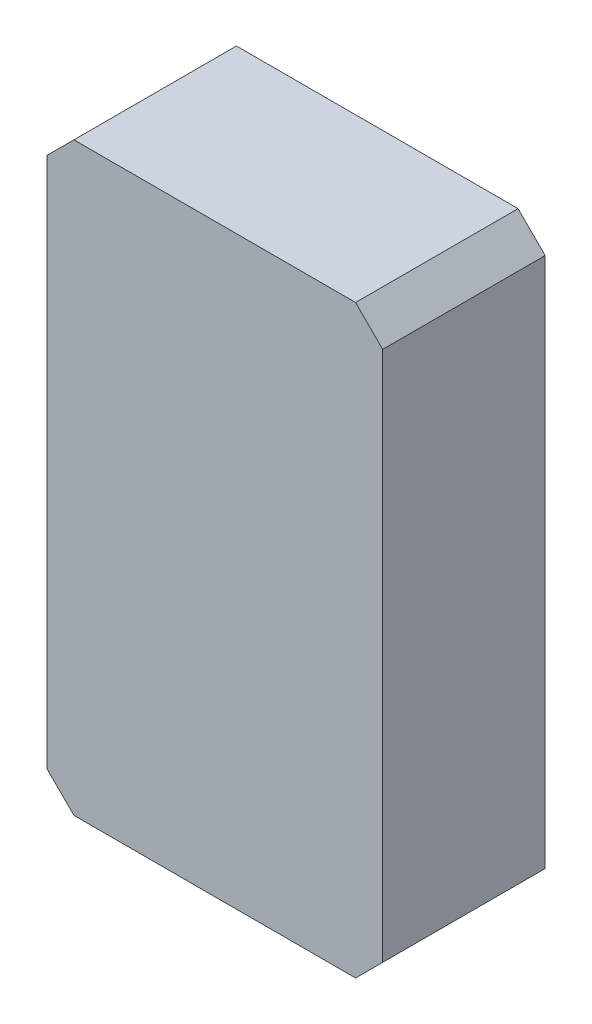
ISO-10303-21;
HEADER;
FILE_DESCRIPTION(('STEP AP214'),'2;1');
FILE_NAME('part.step','',(''),(''),'','','');
FILE_SCHEMA(('AUTOMOTIVE_DESIGN { 1 0 10303 214 1 1 1 1 }'));
ENDSEC;
DATA;
#1=APPLICATION_CONTEXT('core data for automotive mechanical design processes');
#2=APPLICATION_PROTOCOL_DEFINITION('international standard','automotive_design',2000,#1);
#3=PRODUCT_CONTEXT('',#1,'mechanical');
#4=PRODUCT('Part','Part','',(#3));
#5=PRODUCT_RELATED_PRODUCT_CATEGORY('part','',(#4));
#6=PRODUCT_DEFINITION_FORMATION('','',#4);
#7=PRODUCT_DEFINITION_CONTEXT('part definition',#1,'design');
#8=PRODUCT_DEFINITION('design','',#6,#7);
#9=PRODUCT_DEFINITION_SHAPE('','',#8);
#10=(LENGTH_UNIT() NAMED_UNIT(*) SI_UNIT(.MILLI.,.METRE.));
#11=(NAMED_UNIT(*) PLANE_ANGLE_UNIT() SI_UNIT($,.RADIAN.));
#12=(NAMED_UNIT(*) SI_UNIT($,.STERADIAN.) SOLID_ANGLE_UNIT());
#13=UNCERTAINTY_MEASURE_WITH_UNIT(LENGTH_MEASURE(1.E-05),#10,'distance_accuracy_value','');
#14=(GEOMETRIC_REPRESENTATION_CONTEXT(3) GLOBAL_UNCERTAINTY_ASSIGNED_CONTEXT((#13)) GLOBAL_UNIT_ASSIGNED_CONTEXT((#10,
#11,#12)) REPRESENTATION_CONTEXT('',''));
#15=CARTESIAN_POINT('',(0.,0.,0.));
#16=DIRECTION('',(0.,0.,1.));
#17=DIRECTION('',(1.,0.,0.));
#18=AXIS2_PLACEMENT_3D('',#15,#16,#17);
#19=CARTESIAN_POINT('',(-39.37,-68.58,38.1));
#20=DIRECTION('',(0.,0.,1.));
#21=DIRECTION('',(1.,0.,0.));
#22=AXIS2_PLACEMENT_3D('',#19,#20,#21);
#23=PLANE('',#22);
#24=DIRECTION('',(0.707106781186547,0.707106781186548,0.));
#25=VECTOR('',#24,1.);
#26=CARTESIAN_POINT('',(-82.8675,-10.4775,38.1));
#27=LINE('',#26,#25);
#28=CARTESIAN_POINT('',(-78.74,-6.35,38.1));
#29=VERTEX_POINT('',#28);
#30=CARTESIAN_POINT('',(-72.39,0.,38.1));
#31=VERTEX_POINT('',#30);
#32=EDGE_CURVE('E227',#29,#31,#27,.T.);
#33=ORIENTED_EDGE('',*,*,#32,.F.);
#34=DIRECTION('',(0.,-1.,0.));
#35=VECTOR('',#34,1.);
#36=CARTESIAN_POINT('',(-78.74,0.,38.1));
#37=LINE('',#36,#35);
#38=CARTESIAN_POINT('',(-78.74,-130.81,38.1));
#39=VERTEX_POINT('',#38);
#40=EDGE_CURVE('E257',#29,#39,#37,.T.);
#41=ORIENTED_EDGE('',*,*,#40,.T.);
#42=DIRECTION('',(-0.707106781186548,0.707106781186548,0.));
#43=VECTOR('',#42,1.);
#44=CARTESIAN_POINT('',(-82.8675,-126.6825,38.1));
#45=LINE('',#44,#43);
#46=CARTESIAN_POINT('',(-72.39,-137.16,38.1));
#47=VERTEX_POINT('',#46);
#48=EDGE_CURVE('E296',#47,#39,#45,.T.);
#49=ORIENTED_EDGE('',*,*,#48,.F.);
#50=DIRECTION('',(1.,0.,0.));
#51=VECTOR('',#50,1.);
#52=CARTESIAN_POINT('',(-78.74,-137.16,38.1));
#53=LINE('',#52,#51);
#54=CARTESIAN_POINT('',(-6.35,-137.16,38.1));
#55=VERTEX_POINT('',#54);
#56=EDGE_CURVE('E11',#47,#55,#53,.T.);
#57=ORIENTED_EDGE('',*,*,#56,.T.);
#58=DIRECTION('',(-0.707106781186549,-0.707106781186546,0.));
#59=VECTOR('',#58,1.);
#60=CARTESIAN_POINT('',(4.1275,-126.6825,38.1));
#61=LINE('',#60,#59);
#62=CARTESIAN_POINT('',(0.,-130.81,38.1));
#63=VERTEX_POINT('',#62);
#64=EDGE_CURVE('E290',#63,#55,#61,.T.);
#65=ORIENTED_EDGE('',*,*,#64,.F.);
#66=DIRECTION('',(0.,1.,0.));
#67=VECTOR('',#66,1.);
#68=CARTESIAN_POINT('',(0.,-137.16,38.1));
#69=LINE('',#68,#67);
#70=CARTESIAN_POINT('',(0.,-6.35,38.1));
#71=VERTEX_POINT('',#70);
#72=EDGE_CURVE('E285',#63,#71,#69,.T.);
#73=ORIENTED_EDGE('',*,*,#72,.T.);
#74=DIRECTION('',(0.707106781186547,-0.707106781186548,0.));
#75=VECTOR('',#74,1.);
#76=CARTESIAN_POINT('',(4.1275,-10.4775,38.1));
#77=LINE('',#76,#75);
#78=CARTESIAN_POINT('',(-6.35,0.,38.1));
#79=VERTEX_POINT('',#78);
#80=EDGE_CURVE('E211',#79,#71,#77,.T.);
#81=ORIENTED_EDGE('',*,*,#80,.F.);
#82=DIRECTION('',(-1.,0.,0.));
#83=VECTOR('',#82,1.);
#84=CARTESIAN_POINT('',(0.,0.,38.1));
#85=LINE('',#84,#83);
#86=EDGE_CURVE('E26',#79,#31,#85,.T.);
#87=ORIENTED_EDGE('',*,*,#86,.T.);
#88=EDGE_LOOP('',(#33,#41,#49,#57,#65,#73,#81,#87));
#89=FACE_BOUND('',#88,.T.);
#90=ADVANCED_FACE('F17',(#89),#23,.T.);
#91=CARTESIAN_POINT('',(-78.74,-137.16,0.));
#92=DIRECTION('',(0.,-1.,0.));
#93=DIRECTION('',(0.,0.,-1.));
#94=AXIS2_PLACEMENT_3D('',#91,#92,#93);
#95=PLANE('',#94);
#96=DIRECTION('',(0.,0.,1.));
#97=VECTOR('',#96,1.);
#98=CARTESIAN_POINT('',(-66.04,-137.16,13.97));
#99=LINE('',#98,#97);
#100=CARTESIAN_POINT('',(-66.04,-137.16,20.32));
#101=VERTEX_POINT('',#100);
#102=CARTESIAN_POINT('',(-66.04,-137.16,27.94));
#103=VERTEX_POINT('',#102);
#104=EDGE_CURVE('E185',#101,#103,#99,.T.);
#105=ORIENTED_EDGE('',*,*,#104,.T.);
#106=DIRECTION('',(1.,0.,0.));
#107=VECTOR('',#106,1.);
#108=CARTESIAN_POINT('',(-66.675,-137.16,27.94));
#109=LINE('',#108,#107);
#110=CARTESIAN_POINT('',(-54.61,-137.16,27.94));
#111=VERTEX_POINT('',#110);
#112=EDGE_CURVE('E167',#103,#111,#109,.T.);
#113=ORIENTED_EDGE('',*,*,#112,.T.);
#114=DIRECTION('',(0.,0.,-1.));
#115=VECTOR('',#114,1.);
#116=CARTESIAN_POINT('',(-54.61,-137.16,10.16));
#117=LINE('',#116,#115);
#118=CARTESIAN_POINT('',(-54.61,-137.16,20.32));
#119=VERTEX_POINT('',#118);
#120=EDGE_CURVE('E217',#111,#119,#117,.T.);
#121=ORIENTED_EDGE('',*,*,#120,.T.);
#122=DIRECTION('',(-1.,0.,0.));
#123=VECTOR('',#122,1.);
#124=CARTESIAN_POINT('',(-72.39,-137.16,20.32));
#125=LINE('',#124,#123);
#126=EDGE_CURVE('E192',#119,#101,#125,.T.);
#127=ORIENTED_EDGE('',*,*,#126,.T.);
#128=EDGE_LOOP('',(#105,#113,#121,#127));
#129=FACE_BOUND('',#128,.T.);
#130=DIRECTION('',(0.,0.,-1.));
#131=VECTOR('',#130,1.);
#132=CARTESIAN_POINT('',(-12.7,-137.16,4.2545));
#133=LINE('',#132,#131);
#134=CARTESIAN_POINT('',(-12.7,-137.16,8.509));
#135=VERTEX_POINT('',#134);
#136=CARTESIAN_POINT('',(-12.7,-137.16,3.429));
#137=VERTEX_POINT('',#136);
#138=EDGE_CURVE('E331',#135,#137,#133,.T.);
#139=ORIENTED_EDGE('',*,*,#138,.T.);
#140=DIRECTION('',(-1.,0.,0.));
#141=VECTOR('',#140,1.);
#142=CARTESIAN_POINT('',(-45.72,-137.16,3.429));
#143=LINE('',#142,#141);
#144=CARTESIAN_POINT('',(-25.4,-137.16,3.429));
#145=VERTEX_POINT('',#144);
#146=EDGE_CURVE('E204',#137,#145,#143,.T.);
#147=ORIENTED_EDGE('',*,*,#146,.T.);
#148=DIRECTION('',(0.,0.,1.));
#149=VECTOR('',#148,1.);
#150=CARTESIAN_POINT('',(-25.4,-137.16,1.7145));
#151=LINE('',#150,#149);
#152=CARTESIAN_POINT('',(-25.4,-137.16,8.509));
#153=VERTEX_POINT('',#152);
#154=EDGE_CURVE('E315',#145,#153,#151,.T.);
#155=ORIENTED_EDGE('',*,*,#154,.T.);
#156=DIRECTION('',(1.,0.,0.));
#157=VECTOR('',#156,1.);
#158=CARTESIAN_POINT('',(-52.07,-137.16,8.509));
#159=LINE('',#158,#157);
#160=EDGE_CURVE('E342',#153,#135,#159,.T.);
#161=ORIENTED_EDGE('',*,*,#160,.T.);
#162=EDGE_LOOP('',(#139,#147,#155,#161));
#163=FACE_BOUND('',#162,.T.);
#164=CARTESIAN_POINT('',(-19.05,-137.16,23.749));
#165=DIRECTION('',(0.,1.,0.));
#166=DIRECTION('',(1.,0.,0.));
#167=AXIS2_PLACEMENT_3D('',#164,#165,#166);
#168=CIRCLE('',#167,3.175);
#169=CARTESIAN_POINT('',(-15.875,-137.16,23.749));
#170=VERTEX_POINT('',#169);
#171=EDGE_CURVE('E322',#170,#170,#168,.T.);
#172=ORIENTED_EDGE('',*,*,#171,.T.);
#173=EDGE_LOOP('',(#172));
#174=FACE_BOUND('',#173,.T.);
#175=CARTESIAN_POINT('',(-30.48,-137.16,23.749));
#176=DIRECTION('',(0.,1.,0.));
#177=DIRECTION('',(1.,0.,0.));
#178=AXIS2_PLACEMENT_3D('',#175,#176,#177);
#179=CIRCLE('',#178,3.175);
#180=CARTESIAN_POINT('',(-27.305,-137.16,23.749));
#181=VERTEX_POINT('',#180);
#182=EDGE_CURVE('E373',#181,#181,#179,.T.);
#183=ORIENTED_EDGE('',*,*,#182,.T.);
#184=EDGE_LOOP('',(#183));
#185=FACE_BOUND('',#184,.T.);
#186=DIRECTION('',(0.,0.,-1.));
#187=VECTOR('',#186,1.);
#188=CARTESIAN_POINT('',(-6.35,-137.16,0.));
#189=LINE('',#188,#187);
#190=CARTESIAN_POINT('',(-6.35,-137.16,0.));
#191=VERTEX_POINT('',#190);
#192=EDGE_CURVE('E294',#55,#191,#189,.T.);
#193=ORIENTED_EDGE('',*,*,#192,.F.);
#194=ORIENTED_EDGE('',*,*,#56,.F.);
#195=DIRECTION('',(0.,0.,1.));
#196=VECTOR('',#195,1.);
#197=CARTESIAN_POINT('',(-72.39,-137.16,0.));
#198=LINE('',#197,#196);
#199=CARTESIAN_POINT('',(-72.39,-137.16,0.));
#200=VERTEX_POINT('',#199);
#201=EDGE_CURVE('E20',#200,#47,#198,.T.);
#202=ORIENTED_EDGE('',*,*,#201,.F.);
#203=DIRECTION('',(1.,0.,0.));
#204=VECTOR('',#203,1.);
#205=CARTESIAN_POINT('',(-78.74,-137.16,0.));
#206=LINE('',#205,#204);
#207=EDGE_CURVE('E253',#200,#191,#206,.T.);
#208=ORIENTED_EDGE('',*,*,#207,.T.);
#209=EDGE_LOOP('',(#193,#194,#202,#208));
#210=FACE_BOUND('',#209,.T.);
#211=ADVANCED_FACE('F190',(#129,#163,#174,#185,#210),#95,.T.);
#212=CARTESIAN_POINT('',(0.,0.,0.));
#213=DIRECTION('',(0.,1.,0.));
#214=DIRECTION('',(1.,0.,0.));
#215=AXIS2_PLACEMENT_3D('',#212,#213,#214);
#216=PLANE('',#215);
#217=DIRECTION('',(0.,0.,-1.));
#218=VECTOR('',#217,1.);
#219=CARTESIAN_POINT('',(-72.39,0.,0.));
#220=LINE('',#219,#218);
#221=CARTESIAN_POINT('',(-72.39,0.,0.));
#222=VERTEX_POINT('',#221);
#223=EDGE_CURVE('E231',#31,#222,#220,.T.);
#224=ORIENTED_EDGE('',*,*,#223,.F.);
#225=ORIENTED_EDGE('',*,*,#86,.F.);
#226=DIRECTION('',(0.,0.,1.));
#227=VECTOR('',#226,1.);
#228=CARTESIAN_POINT('',(-6.35,0.,0.));
#229=LINE('',#228,#227);
#230=CARTESIAN_POINT('',(-6.35,0.,0.));
#231=VERTEX_POINT('',#230);
#232=EDGE_CURVE('E210',#231,#79,#229,.T.);
#233=ORIENTED_EDGE('',*,*,#232,.F.);
#234=DIRECTION('',(-1.,0.,0.));
#235=VECTOR('',#234,1.);
#236=CARTESIAN_POINT('',(0.,0.,0.));
#237=LINE('',#236,#235);
#238=EDGE_CURVE('E261',#231,#222,#237,.T.);
#239=ORIENTED_EDGE('',*,*,#238,.T.);
#240=EDGE_LOOP('',(#224,#225,#233,#239));
#241=FACE_BOUND('',#240,.T.);
#242=ADVANCED_FACE('F404',(#241),#216,.T.);
#243=CARTESIAN_POINT('',(-75.565,-133.985,0.));
#244=DIRECTION('',(-0.707106781186548,-0.707106781186548,0.));
#245=DIRECTION('',(-0.707106781186548,0.707106781186548,0.));
#246=AXIS2_PLACEMENT_3D('',#243,#244,#245);
#247=PLANE('',#246);
#248=ORIENTED_EDGE('',*,*,#48,.T.);
#249=DIRECTION('',(0.,0.,-1.));
#250=VECTOR('',#249,1.);
#251=CARTESIAN_POINT('',(-78.74,-130.81,0.));
#252=LINE('',#251,#250);
#253=CARTESIAN_POINT('',(-78.74,-130.81,0.));
#254=VERTEX_POINT('',#253);
#255=EDGE_CURVE('E248',#39,#254,#252,.T.);
#256=ORIENTED_EDGE('',*,*,#255,.T.);
#257=DIRECTION('',(0.707106781186548,-0.707106781186548,0.));
#258=VECTOR('',#257,1.);
#259=CARTESIAN_POINT('',(-82.8675,-126.6825,0.));
#260=LINE('',#259,#258);
#261=EDGE_CURVE('E249',#254,#200,#260,.T.);
#262=ORIENTED_EDGE('',*,*,#261,.T.);
#263=ORIENTED_EDGE('',*,*,#201,.T.);
#264=EDGE_LOOP('',(#248,#256,#262,#263));
#265=FACE_BOUND('',#264,.T.);
#266=ADVANCED_FACE('F412',(#265),#247,.T.);
#267=CARTESIAN_POINT('',(-3.17499999999995,-133.985,0.));
#268=DIRECTION('',(0.707106781186546,-0.707106781186549,0.));
#269=DIRECTION('',(0.,0.,-1.));
#270=AXIS2_PLACEMENT_3D('',#267,#268,#269);
#271=PLANE('',#270);
#272=ORIENTED_EDGE('',*,*,#64,.T.);
#273=ORIENTED_EDGE('',*,*,#192,.T.);
#274=DIRECTION('',(0.707106781186549,0.707106781186546,0.));
#275=VECTOR('',#274,1.);
#276=CARTESIAN_POINT('',(4.1275,-126.6825,0.));
#277=LINE('',#276,#275);
#278=CARTESIAN_POINT('',(0.,-130.81,0.));
#279=VERTEX_POINT('',#278);
#280=EDGE_CURVE('E265',#191,#279,#277,.T.);
#281=ORIENTED_EDGE('',*,*,#280,.T.);
#282=DIRECTION('',(0.,0.,1.));
#283=VECTOR('',#282,1.);
#284=CARTESIAN_POINT('',(0.,-130.81,0.));
#285=LINE('',#284,#283);
#286=EDGE_CURVE('E286',#279,#63,#285,.T.);
#287=ORIENTED_EDGE('',*,*,#286,.T.);
#288=EDGE_LOOP('',(#272,#273,#281,#287));
#289=FACE_BOUND('',#288,.T.);
#290=ADVANCED_FACE('F419',(#289),#271,.T.);
#291=CARTESIAN_POINT('',(0.,-137.16,0.));
#292=DIRECTION('',(1.,0.,0.));
#293=DIRECTION('',(0.,1.,0.));
#294=AXIS2_PLACEMENT_3D('',#291,#292,#293);
#295=PLANE('',#294);
#296=DIRECTION('',(0.,0.,-1.));
#297=VECTOR('',#296,1.);
#298=CARTESIAN_POINT('',(0.,-6.35,0.));
#299=LINE('',#298,#297);
#300=CARTESIAN_POINT('',(0.,-6.35,0.));
#301=VERTEX_POINT('',#300);
#302=EDGE_CURVE('E208',#71,#301,#299,.T.);
#303=ORIENTED_EDGE('',*,*,#302,.F.);
#304=ORIENTED_EDGE('',*,*,#72,.F.);
#305=ORIENTED_EDGE('',*,*,#286,.F.);
#306=DIRECTION('',(0.,1.,0.));
#307=VECTOR('',#306,1.);
#308=CARTESIAN_POINT('',(0.,-137.16,0.));
#309=LINE('',#308,#307);
#310=EDGE_CURVE('E269',#279,#301,#309,.T.);
#311=ORIENTED_EDGE('',*,*,#310,.T.);
#312=EDGE_LOOP('',(#303,#304,#305,#311));
#313=FACE_BOUND('',#312,.T.);
#314=ADVANCED_FACE('F425',(#313),#295,.T.);
#315=CARTESIAN_POINT('',(-3.175,-3.175,0.));
#316=DIRECTION('',(0.707106781186548,0.707106781186547,0.));
#317=DIRECTION('',(0.,0.,-1.));
#318=AXIS2_PLACEMENT_3D('',#315,#316,#317);
#319=PLANE('',#318);
#320=ORIENTED_EDGE('',*,*,#80,.T.);
#321=ORIENTED_EDGE('',*,*,#302,.T.);
#322=DIRECTION('',(-0.707106781186547,0.707106781186548,0.));
#323=VECTOR('',#322,1.);
#324=CARTESIAN_POINT('',(4.1275,-10.4775,0.));
#325=LINE('',#324,#323);
#326=EDGE_CURVE('E264',#301,#231,#325,.T.);
#327=ORIENTED_EDGE('',*,*,#326,.T.);
#328=ORIENTED_EDGE('',*,*,#232,.T.);
#329=EDGE_LOOP('',(#320,#321,#327,#328));
#330=FACE_BOUND('',#329,.T.);
#331=ADVANCED_FACE('F428',(#330),#319,.T.);
#332=CARTESIAN_POINT('',(-39.37,-68.58,0.));
#333=DIRECTION('',(0.,0.,1.));
#334=DIRECTION('',(1.,0.,0.));
#335=AXIS2_PLACEMENT_3D('',#332,#333,#334);
#336=PLANE('',#335);
#337=DIRECTION('',(-0.707106781186547,-0.707106781186548,0.));
#338=VECTOR('',#337,1.);
#339=CARTESIAN_POINT('',(-82.8675,-10.4775,0.));
#340=LINE('',#339,#338);
#341=CARTESIAN_POINT('',(-78.74,-6.35,0.));
#342=VERTEX_POINT('',#341);
#343=EDGE_CURVE('E236',#222,#342,#340,.T.);
#344=ORIENTED_EDGE('',*,*,#343,.F.);
#345=ORIENTED_EDGE('',*,*,#238,.F.);
#346=ORIENTED_EDGE('',*,*,#326,.F.);
#347=ORIENTED_EDGE('',*,*,#310,.F.);
#348=ORIENTED_EDGE('',*,*,#280,.F.);
#349=ORIENTED_EDGE('',*,*,#207,.F.);
#350=ORIENTED_EDGE('',*,*,#261,.F.);
#351=DIRECTION('',(0.,-1.,0.));
#352=VECTOR('',#351,1.);
#353=CARTESIAN_POINT('',(-78.74,0.,0.));
#354=LINE('',#353,#352);
#355=EDGE_CURVE('E244',#342,#254,#354,.T.);
#356=ORIENTED_EDGE('',*,*,#355,.F.);
#357=EDGE_LOOP('',(#344,#345,#346,#347,#348,#349,#350,#356));
#358=FACE_BOUND('',#357,.T.);
#359=ADVANCED_FACE('F416',(#358),#336,.F.);
#360=CARTESIAN_POINT('',(-78.74,0.,0.));
#361=DIRECTION('',(-1.,0.,0.));
#362=DIRECTION('',(0.,1.,0.));
#363=AXIS2_PLACEMENT_3D('',#360,#361,#362);
#364=PLANE('',#363);
#365=DIRECTION('',(0.,0.,1.));
#366=VECTOR('',#365,1.);
#367=CARTESIAN_POINT('',(-78.74,-6.35,0.));
#368=LINE('',#367,#366);
#369=EDGE_CURVE('E240',#342,#29,#368,.T.);
#370=ORIENTED_EDGE('',*,*,#369,.F.);
#371=ORIENTED_EDGE('',*,*,#355,.T.);
#372=ORIENTED_EDGE('',*,*,#255,.F.);
#373=ORIENTED_EDGE('',*,*,#40,.F.);
#374=EDGE_LOOP('',(#370,#371,#372,#373));
#375=FACE_BOUND('',#374,.T.);
#376=ADVANCED_FACE('F411',(#375),#364,.T.);
#377=CARTESIAN_POINT('',(-75.565,-3.175,0.));
#378=DIRECTION('',(-0.707106781186548,0.707106781186547,0.));
#379=DIRECTION('',(0.,0.,1.));
#380=AXIS2_PLACEMENT_3D('',#377,#378,#379);
#381=PLANE('',#380);
#382=ORIENTED_EDGE('',*,*,#32,.T.);
#383=ORIENTED_EDGE('',*,*,#223,.T.);
#384=ORIENTED_EDGE('',*,*,#343,.T.);
#385=ORIENTED_EDGE('',*,*,#369,.T.);
#386=EDGE_LOOP('',(#382,#383,#384,#385));
#387=FACE_BOUND('',#386,.T.);
#388=ADVANCED_FACE('F407',(#387),#381,.T.);
#389=CARTESIAN_POINT('',(-60.325,-143.51,24.13));
#390=DIRECTION('',(0.,-1.,0.));
#391=DIRECTION('',(0.,0.,-1.));
#392=AXIS2_PLACEMENT_3D('',#389,#390,#391);
#393=PLANE('',#392);
#394=DIRECTION('',(1.,0.,0.));
#395=VECTOR('',#394,1.);
#396=CARTESIAN_POINT('',(-66.04,-143.51,20.32));
#397=LINE('',#396,#395);
#398=CARTESIAN_POINT('',(-66.04,-143.51,20.32));
#399=VERTEX_POINT('',#398);
#400=CARTESIAN_POINT('',(-54.61,-143.51,20.32));
#401=VERTEX_POINT('',#400);
#402=EDGE_CURVE('E232',#399,#401,#397,.T.);
#403=ORIENTED_EDGE('',*,*,#402,.T.);
#404=DIRECTION('',(0.,0.,1.));
#405=VECTOR('',#404,1.);
#406=CARTESIAN_POINT('',(-54.61,-143.51,20.32));
#407=LINE('',#406,#405);
#408=CARTESIAN_POINT('',(-54.61,-143.51,27.94));
#409=VERTEX_POINT('',#408);
#410=EDGE_CURVE('E220',#401,#409,#407,.T.);
#411=ORIENTED_EDGE('',*,*,#410,.T.);
#412=DIRECTION('',(-1.,0.,0.));
#413=VECTOR('',#412,1.);
#414=CARTESIAN_POINT('',(-54.61,-143.51,27.94));
#415=LINE('',#414,#413);
#416=CARTESIAN_POINT('',(-66.04,-143.51,27.94));
#417=VERTEX_POINT('',#416);
#418=EDGE_CURVE('E179',#409,#417,#415,.T.);
#419=ORIENTED_EDGE('',*,*,#418,.T.);
#420=DIRECTION('',(0.,0.,-1.));
#421=VECTOR('',#420,1.);
#422=CARTESIAN_POINT('',(-66.04,-143.51,27.94));
#423=LINE('',#422,#421);
#424=EDGE_CURVE('E187',#417,#399,#423,.T.);
#425=ORIENTED_EDGE('',*,*,#424,.T.);
#426=EDGE_LOOP('',(#403,#411,#419,#425));
#427=FACE_BOUND('',#426,.T.);
#428=ADVANCED_FACE('F446',(#427),#393,.T.);
#429=CARTESIAN_POINT('',(-66.04,-137.16,20.32));
#430=DIRECTION('',(0.,0.,-1.));
#431=DIRECTION('',(0.,-1.,0.));
#432=AXIS2_PLACEMENT_3D('',#429,#430,#431);
#433=PLANE('',#432);
#434=ORIENTED_EDGE('',*,*,#126,.F.);
#435=DIRECTION('',(0.,-1.,0.));
#436=VECTOR('',#435,1.);
#437=CARTESIAN_POINT('',(-54.61,-137.16,20.32));
#438=LINE('',#437,#436);
#439=EDGE_CURVE('E222',#119,#401,#438,.T.);
#440=ORIENTED_EDGE('',*,*,#439,.T.);
#441=ORIENTED_EDGE('',*,*,#402,.F.);
#442=DIRECTION('',(0.,-1.,0.));
#443=VECTOR('',#442,1.);
#444=CARTESIAN_POINT('',(-66.04,-137.16,20.32));
#445=LINE('',#444,#443);
#446=EDGE_CURVE('E195',#101,#399,#445,.T.);
#447=ORIENTED_EDGE('',*,*,#446,.F.);
#448=EDGE_LOOP('',(#434,#440,#441,#447));
#449=FACE_BOUND('',#448,.T.);
#450=ADVANCED_FACE('F449',(#449),#433,.T.);
#451=CARTESIAN_POINT('',(-54.61,-137.16,20.32));
#452=DIRECTION('',(1.,0.,0.));
#453=DIRECTION('',(0.,1.,0.));
#454=AXIS2_PLACEMENT_3D('',#451,#452,#453);
#455=PLANE('',#454);
#456=ORIENTED_EDGE('',*,*,#120,.F.);
#457=DIRECTION('',(0.,-1.,0.));
#458=VECTOR('',#457,1.);
#459=CARTESIAN_POINT('',(-54.61,-137.16,27.94));
#460=LINE('',#459,#458);
#461=EDGE_CURVE('E174',#111,#409,#460,.T.);
#462=ORIENTED_EDGE('',*,*,#461,.T.);
#463=ORIENTED_EDGE('',*,*,#410,.F.);
#464=ORIENTED_EDGE('',*,*,#439,.F.);
#465=EDGE_LOOP('',(#456,#462,#463,#464));
#466=FACE_BOUND('',#465,.T.);
#467=ADVANCED_FACE('F453',(#466),#455,.T.);
#468=CARTESIAN_POINT('',(-54.61,-137.16,27.94));
#469=DIRECTION('',(0.,0.,1.));
#470=DIRECTION('',(1.,0.,0.));
#471=AXIS2_PLACEMENT_3D('',#468,#469,#470);
#472=PLANE('',#471);
#473=ORIENTED_EDGE('',*,*,#112,.F.);
#474=DIRECTION('',(0.,-1.,0.));
#475=VECTOR('',#474,1.);
#476=CARTESIAN_POINT('',(-66.04,-137.16,27.94));
#477=LINE('',#476,#475);
#478=EDGE_CURVE('E171',#103,#417,#477,.T.);
#479=ORIENTED_EDGE('',*,*,#478,.T.);
#480=ORIENTED_EDGE('',*,*,#418,.F.);
#481=ORIENTED_EDGE('',*,*,#461,.F.);
#482=EDGE_LOOP('',(#473,#479,#480,#481));
#483=FACE_BOUND('',#482,.T.);
#484=ADVANCED_FACE('F169',(#483),#472,.T.);
#485=CARTESIAN_POINT('',(-66.04,-137.16,27.94));
#486=DIRECTION('',(-1.,0.,0.));
#487=DIRECTION('',(0.,0.,1.));
#488=AXIS2_PLACEMENT_3D('',#485,#486,#487);
#489=PLANE('',#488);
#490=ORIENTED_EDGE('',*,*,#104,.F.);
#491=ORIENTED_EDGE('',*,*,#446,.T.);
#492=ORIENTED_EDGE('',*,*,#424,.F.);
#493=ORIENTED_EDGE('',*,*,#478,.F.);
#494=EDGE_LOOP('',(#490,#491,#492,#493));
#495=FACE_BOUND('',#494,.T.);
#496=ADVANCED_FACE('F183',(#495),#489,.T.);
#497=CARTESIAN_POINT('',(-19.05,-130.81,5.969));
#498=DIRECTION('',(0.,1.,0.));
#499=DIRECTION('',(1.,0.,0.));
#500=AXIS2_PLACEMENT_3D('',#497,#498,#499);
#501=PLANE('',#500);
#502=DIRECTION('',(-1.,0.,0.));
#503=VECTOR('',#502,1.);
#504=CARTESIAN_POINT('',(-25.4,-130.81,3.429));
#505=LINE('',#504,#503);
#506=CARTESIAN_POINT('',(-12.7,-130.81,3.429));
#507=VERTEX_POINT('',#506);
#508=CARTESIAN_POINT('',(-25.4,-130.81,3.429));
#509=VERTEX_POINT('',#508);
#510=EDGE_CURVE('E196',#507,#509,#505,.T.);
#511=ORIENTED_EDGE('',*,*,#510,.F.);
#512=DIRECTION('',(0.,0.,-1.));
#513=VECTOR('',#512,1.);
#514=CARTESIAN_POINT('',(-12.7,-130.81,3.429));
#515=LINE('',#514,#513);
#516=CARTESIAN_POINT('',(-12.7,-130.81,8.509));
#517=VERTEX_POINT('',#516);
#518=EDGE_CURVE('E341',#517,#507,#515,.T.);
#519=ORIENTED_EDGE('',*,*,#518,.F.);
#520=DIRECTION('',(1.,0.,0.));
#521=VECTOR('',#520,1.);
#522=CARTESIAN_POINT('',(-12.7,-130.81,8.509));
#523=LINE('',#522,#521);
#524=CARTESIAN_POINT('',(-25.4,-130.81,8.509));
#525=VERTEX_POINT('',#524);
#526=EDGE_CURVE('E319',#525,#517,#523,.T.);
#527=ORIENTED_EDGE('',*,*,#526,.F.);
#528=DIRECTION('',(0.,0.,1.));
#529=VECTOR('',#528,1.);
#530=CARTESIAN_POINT('',(-25.4,-130.81,8.509));
#531=LINE('',#530,#529);
#532=EDGE_CURVE('E313',#509,#525,#531,.T.);
#533=ORIENTED_EDGE('',*,*,#532,.F.);
#534=EDGE_LOOP('',(#511,#519,#527,#533));
#535=FACE_BOUND('',#534,.T.);
#536=ADVANCED_FACE('F459',(#535),#501,.F.);
#537=CARTESIAN_POINT('',(-12.7,-137.16,3.429));
#538=DIRECTION('',(0.,0.,-1.));
#539=DIRECTION('',(0.,-1.,0.));
#540=AXIS2_PLACEMENT_3D('',#537,#538,#539);
#541=PLANE('',#540);
#542=ORIENTED_EDGE('',*,*,#146,.F.);
#543=DIRECTION('',(0.,1.,0.));
#544=VECTOR('',#543,1.);
#545=CARTESIAN_POINT('',(-12.7,-137.16,3.429));
#546=LINE('',#545,#544);
#547=EDGE_CURVE('E346',#137,#507,#546,.T.);
#548=ORIENTED_EDGE('',*,*,#547,.T.);
#549=ORIENTED_EDGE('',*,*,#510,.T.);
#550=DIRECTION('',(0.,1.,0.));
#551=VECTOR('',#550,1.);
#552=CARTESIAN_POINT('',(-25.4,-137.16,3.429));
#553=LINE('',#552,#551);
#554=EDGE_CURVE('E318',#145,#509,#553,.T.);
#555=ORIENTED_EDGE('',*,*,#554,.F.);
#556=EDGE_LOOP('',(#542,#548,#549,#555));
#557=FACE_BOUND('',#556,.T.);
#558=ADVANCED_FACE('F460',(#557),#541,.F.);
#559=CARTESIAN_POINT('',(-25.4,-137.16,3.429));
#560=DIRECTION('',(-1.,0.,0.));
#561=DIRECTION('',(0.,0.,1.));
#562=AXIS2_PLACEMENT_3D('',#559,#560,#561);
#563=PLANE('',#562);
#564=ORIENTED_EDGE('',*,*,#154,.F.);
#565=ORIENTED_EDGE('',*,*,#554,.T.);
#566=ORIENTED_EDGE('',*,*,#532,.T.);
#567=DIRECTION('',(0.,1.,0.));
#568=VECTOR('',#567,1.);
#569=CARTESIAN_POINT('',(-25.4,-137.16,8.509));
#570=LINE('',#569,#568);
#571=EDGE_CURVE('E345',#153,#525,#570,.T.);
#572=ORIENTED_EDGE('',*,*,#571,.F.);
#573=EDGE_LOOP('',(#564,#565,#566,#572));
#574=FACE_BOUND('',#573,.T.);
#575=ADVANCED_FACE('F463',(#574),#563,.F.);
#576=CARTESIAN_POINT('',(-25.4,-137.16,8.509));
#577=DIRECTION('',(0.,0.,1.));
#578=DIRECTION('',(1.,0.,0.));
#579=AXIS2_PLACEMENT_3D('',#576,#577,#578);
#580=PLANE('',#579);
#581=ORIENTED_EDGE('',*,*,#160,.F.);
#582=ORIENTED_EDGE('',*,*,#571,.T.);
#583=ORIENTED_EDGE('',*,*,#526,.T.);
#584=DIRECTION('',(0.,1.,0.));
#585=VECTOR('',#584,1.);
#586=CARTESIAN_POINT('',(-12.7,-137.16,8.509));
#587=LINE('',#586,#585);
#588=EDGE_CURVE('E337',#135,#517,#587,.T.);
#589=ORIENTED_EDGE('',*,*,#588,.F.);
#590=EDGE_LOOP('',(#581,#582,#583,#589));
#591=FACE_BOUND('',#590,.T.);
#592=ADVANCED_FACE('F470',(#591),#580,.F.);
#593=CARTESIAN_POINT('',(-12.7,-137.16,8.509));
#594=DIRECTION('',(1.,0.,0.));
#595=DIRECTION('',(0.,1.,0.));
#596=AXIS2_PLACEMENT_3D('',#593,#594,#595);
#597=PLANE('',#596);
#598=ORIENTED_EDGE('',*,*,#138,.F.);
#599=ORIENTED_EDGE('',*,*,#588,.T.);
#600=ORIENTED_EDGE('',*,*,#518,.T.);
#601=ORIENTED_EDGE('',*,*,#547,.F.);
#602=EDGE_LOOP('',(#598,#599,#600,#601));
#603=FACE_BOUND('',#602,.T.);
#604=ADVANCED_FACE('F478',(#603),#597,.F.);
#605=CARTESIAN_POINT('',(-19.05,-130.81,23.749));
#606=DIRECTION('',(0.,-1.,0.));
#607=DIRECTION('',(0.,0.,-1.));
#608=AXIS2_PLACEMENT_3D('',#605,#606,#607);
#609=PLANE('',#608);
#610=CARTESIAN_POINT('',(-19.05,-130.81,23.749));
#611=DIRECTION('',(0.,1.,0.));
#612=DIRECTION('',(1.,0.,0.));
#613=AXIS2_PLACEMENT_3D('',#610,#611,#612);
#614=CIRCLE('',#613,3.175);
#615=CARTESIAN_POINT('',(-15.875,-130.81,23.749));
#616=VERTEX_POINT('',#615);
#617=EDGE_CURVE('E326',#616,#616,#614,.T.);
#618=ORIENTED_EDGE('',*,*,#617,.F.);
#619=EDGE_LOOP('',(#618));
#620=FACE_BOUND('',#619,.T.);
#621=ADVANCED_FACE('F481',(#620),#609,.T.);
#622=CARTESIAN_POINT('',(-19.05,-137.16,23.749));
#623=DIRECTION('',(0.,1.,0.));
#624=DIRECTION('',(1.,0.,0.));
#625=AXIS2_PLACEMENT_3D('',#622,#623,#624);
#626=CYLINDRICAL_SURFACE('',#625,3.175);
#627=ORIENTED_EDGE('',*,*,#617,.T.);
#628=EDGE_LOOP('',(#627));
#629=FACE_BOUND('',#628,.T.);
#630=ORIENTED_EDGE('',*,*,#171,.F.);
#631=EDGE_LOOP('',(#630));
#632=FACE_BOUND('',#631,.T.);
#633=ADVANCED_FACE('F396',(#629,#632),#626,.F.);
#634=CARTESIAN_POINT('',(-30.48,-130.81,23.749));
#635=DIRECTION('',(0.,-1.,0.));
#636=DIRECTION('',(0.,0.,-1.));
#637=AXIS2_PLACEMENT_3D('',#634,#635,#636);
#638=PLANE('',#637);
#639=CARTESIAN_POINT('',(-30.48,-130.81,23.749));
#640=DIRECTION('',(0.,1.,0.));
#641=DIRECTION('',(1.,0.,0.));
#642=AXIS2_PLACEMENT_3D('',#639,#640,#641);
#643=CIRCLE('',#642,3.175);
#644=CARTESIAN_POINT('',(-27.305,-130.81,23.749));
#645=VERTEX_POINT('',#644);
#646=EDGE_CURVE('E327',#645,#645,#643,.T.);
#647=ORIENTED_EDGE('',*,*,#646,.F.);
#648=EDGE_LOOP('',(#647));
#649=FACE_BOUND('',#648,.T.);
#650=ADVANCED_FACE('F390',(#649),#638,.T.);
#651=CARTESIAN_POINT('',(-30.48,-137.16,23.749));
#652=DIRECTION('',(0.,1.,0.));
#653=DIRECTION('',(1.,0.,0.));
#654=AXIS2_PLACEMENT_3D('',#651,#652,#653);
#655=CYLINDRICAL_SURFACE('',#654,3.175);
#656=ORIENTED_EDGE('',*,*,#646,.T.);
#657=EDGE_LOOP('',(#656));
#658=FACE_BOUND('',#657,.T.);
#659=ORIENTED_EDGE('',*,*,#182,.F.);
#660=EDGE_LOOP('',(#659));
#661=FACE_BOUND('',#660,.T.);
#662=ADVANCED_FACE('F388',(#658,#661),#655,.F.);
#663=CLOSED_SHELL('',(#90,#211,#242,#266,#290,#314,#331,#359,#376,#388,#428,#450,#467,#484,#496,
#536,#558,#575,#592,#604,#621,#633,#650,#662));
#664=MANIFOLD_SOLID_BREP('B1',#663);
#665=ADVANCED_BREP_SHAPE_REPRESENTATION('',(#18,#664),#14);
#666=SHAPE_DEFINITION_REPRESENTATION(#9,#665);
ENDSEC;
END-ISO-10303-21;
